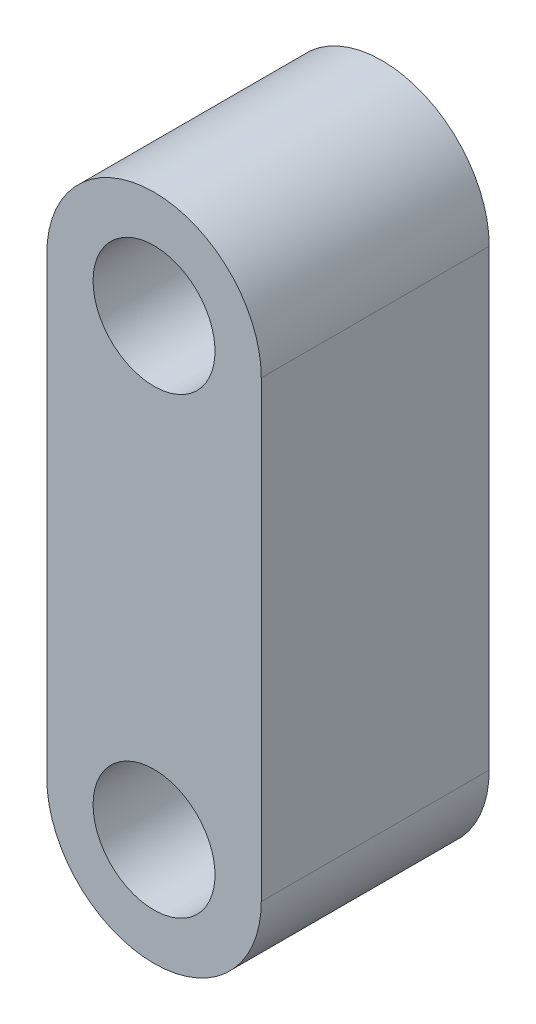
ISO-10303-21;
HEADER;
FILE_DESCRIPTION(('STEP AP214'),'2;1');
FILE_NAME('part.step','',(''),(''),'','','');
FILE_SCHEMA(('AUTOMOTIVE_DESIGN { 1 0 10303 214 1 1 1 1 }'));
ENDSEC;
DATA;
#1=APPLICATION_CONTEXT('core data for automotive mechanical design processes');
#2=APPLICATION_PROTOCOL_DEFINITION('international standard','automotive_design',2000,#1);
#3=PRODUCT_CONTEXT('',#1,'mechanical');
#4=PRODUCT('Part','Part','',(#3));
#5=PRODUCT_RELATED_PRODUCT_CATEGORY('part','',(#4));
#6=PRODUCT_DEFINITION_FORMATION('','',#4);
#7=PRODUCT_DEFINITION_CONTEXT('part definition',#1,'design');
#8=PRODUCT_DEFINITION('design','',#6,#7);
#9=PRODUCT_DEFINITION_SHAPE('','',#8);
#10=(LENGTH_UNIT() NAMED_UNIT(*) SI_UNIT(.MILLI.,.METRE.));
#11=(NAMED_UNIT(*) PLANE_ANGLE_UNIT() SI_UNIT($,.RADIAN.));
#12=(NAMED_UNIT(*) SI_UNIT($,.STERADIAN.) SOLID_ANGLE_UNIT());
#13=UNCERTAINTY_MEASURE_WITH_UNIT(LENGTH_MEASURE(1.E-05),#10,'distance_accuracy_value','');
#14=(GEOMETRIC_REPRESENTATION_CONTEXT(3) GLOBAL_UNCERTAINTY_ASSIGNED_CONTEXT((#13)) GLOBAL_UNIT_ASSIGNED_CONTEXT((#10,
#11,#12)) REPRESENTATION_CONTEXT('',''));
#15=CARTESIAN_POINT('',(0.,0.,0.));
#16=DIRECTION('',(0.,0.,1.));
#17=DIRECTION('',(1.,0.,0.));
#18=AXIS2_PLACEMENT_3D('',#15,#16,#17);
#19=CARTESIAN_POINT('',(0.,-18.9531453168014,19.05));
#20=DIRECTION('',(0.,0.,1.));
#21=DIRECTION('',(1.,0.,0.));
#22=AXIS2_PLACEMENT_3D('',#19,#20,#21);
#23=PLANE('',#22);
#24=CARTESIAN_POINT('',(0.,18.9531453168014,19.05));
#25=DIRECTION('',(0.,0.,1.));
#26=DIRECTION('',(1.,0.,0.));
#27=AXIS2_PLACEMENT_3D('',#24,#25,#26);
#28=CIRCLE('',#27,5.09524);
#29=CARTESIAN_POINT('',(-5.09524,18.9531453168014,19.05));
#30=VERTEX_POINT('',#29);
#31=EDGE_CURVE('E118',#30,#30,#28,.T.);
#32=ORIENTED_EDGE('',*,*,#31,.F.);
#33=EDGE_LOOP('',(#32));
#34=FACE_BOUND('',#33,.T.);
#35=CARTESIAN_POINT('',(0.,-18.9531453168014,19.05));
#36=DIRECTION('',(0.,0.,1.));
#37=DIRECTION('',(1.,0.,0.));
#38=AXIS2_PLACEMENT_3D('',#35,#36,#37);
#39=CIRCLE('',#38,8.96306379513761);
#40=CARTESIAN_POINT('',(-8.96306379513761,-18.9531453168014,19.05));
#41=VERTEX_POINT('',#40);
#42=CARTESIAN_POINT('',(8.96306379513761,-18.9531453168014,19.05));
#43=VERTEX_POINT('',#42);
#44=EDGE_CURVE('E97',#41,#43,#39,.T.);
#45=ORIENTED_EDGE('',*,*,#44,.T.);
#46=DIRECTION('',(0.,1.,0.));
#47=VECTOR('',#46,1.);
#48=CARTESIAN_POINT('',(8.96306379513761,-18.9531453168014,19.05));
#49=LINE('',#48,#47);
#50=CARTESIAN_POINT('',(8.96306379513761,18.9531453168014,19.05));
#51=VERTEX_POINT('',#50);
#52=EDGE_CURVE('E93',#43,#51,#49,.T.);
#53=ORIENTED_EDGE('',*,*,#52,.T.);
#54=CARTESIAN_POINT('',(0.,18.9531453168014,19.05));
#55=DIRECTION('',(0.,0.,1.));
#56=DIRECTION('',(1.,0.,0.));
#57=AXIS2_PLACEMENT_3D('',#54,#55,#56);
#58=CIRCLE('',#57,8.96306379513761);
#59=CARTESIAN_POINT('',(-8.96306379513761,18.9531453168014,19.05));
#60=VERTEX_POINT('',#59);
#61=EDGE_CURVE('E96',#51,#60,#58,.T.);
#62=ORIENTED_EDGE('',*,*,#61,.T.);
#63=DIRECTION('',(0.,-1.,0.));
#64=VECTOR('',#63,1.);
#65=CARTESIAN_POINT('',(-8.96306379513761,-18.9531453168014,19.05));
#66=LINE('',#65,#64);
#67=EDGE_CURVE('E63',#60,#41,#66,.T.);
#68=ORIENTED_EDGE('',*,*,#67,.T.);
#69=EDGE_LOOP('',(#45,#53,#62,#68));
#70=FACE_BOUND('',#69,.T.);
#71=CARTESIAN_POINT('',(0.,-18.9531453168014,19.05));
#72=DIRECTION('',(0.,0.,1.));
#73=DIRECTION('',(1.,0.,0.));
#74=AXIS2_PLACEMENT_3D('',#71,#72,#73);
#75=CIRCLE('',#74,5.09524);
#76=CARTESIAN_POINT('',(-5.09524,-18.9531453168014,19.05));
#77=VERTEX_POINT('',#76);
#78=EDGE_CURVE('E139',#77,#77,#75,.T.);
#79=ORIENTED_EDGE('',*,*,#78,.F.);
#80=EDGE_LOOP('',(#79));
#81=FACE_BOUND('',#80,.T.);
#82=ADVANCED_FACE('F44',(#34,#70,#81),#23,.T.);
#83=CARTESIAN_POINT('',(0.,-18.9531453168014,0.));
#84=DIRECTION('',(0.,0.,1.));
#85=DIRECTION('',(1.,0.,0.));
#86=AXIS2_PLACEMENT_3D('',#83,#84,#85);
#87=PLANE('',#86);
#88=CARTESIAN_POINT('',(0.,-18.9531453168014,0.));
#89=DIRECTION('',(0.,0.,1.));
#90=DIRECTION('',(1.,0.,0.));
#91=AXIS2_PLACEMENT_3D('',#88,#89,#90);
#92=CIRCLE('',#91,8.96306379513761);
#93=CARTESIAN_POINT('',(-8.96306379513761,-18.9531453168014,0.));
#94=VERTEX_POINT('',#93);
#95=CARTESIAN_POINT('',(8.96306379513761,-18.9531453168014,0.));
#96=VERTEX_POINT('',#95);
#97=EDGE_CURVE('E114',#94,#96,#92,.T.);
#98=ORIENTED_EDGE('',*,*,#97,.F.);
#99=DIRECTION('',(0.,-1.,0.));
#100=VECTOR('',#99,1.);
#101=CARTESIAN_POINT('',(-8.96306379513761,-18.9531453168014,0.));
#102=LINE('',#101,#100);
#103=CARTESIAN_POINT('',(-8.96306379513761,18.9531453168014,0.));
#104=VERTEX_POINT('',#103);
#105=EDGE_CURVE('E86',#104,#94,#102,.T.);
#106=ORIENTED_EDGE('',*,*,#105,.F.);
#107=CARTESIAN_POINT('',(0.,18.9531453168014,0.));
#108=DIRECTION('',(0.,0.,1.));
#109=DIRECTION('',(1.,0.,0.));
#110=AXIS2_PLACEMENT_3D('',#107,#108,#109);
#111=CIRCLE('',#110,8.96306379513761);
#112=CARTESIAN_POINT('',(8.96306379513761,18.9531453168014,0.));
#113=VERTEX_POINT('',#112);
#114=EDGE_CURVE('E79',#113,#104,#111,.T.);
#115=ORIENTED_EDGE('',*,*,#114,.F.);
#116=DIRECTION('',(0.,1.,0.));
#117=VECTOR('',#116,1.);
#118=CARTESIAN_POINT('',(8.96306379513761,-18.9531453168014,0.));
#119=LINE('',#118,#117);
#120=EDGE_CURVE('E104',#96,#113,#119,.T.);
#121=ORIENTED_EDGE('',*,*,#120,.F.);
#122=EDGE_LOOP('',(#98,#106,#115,#121));
#123=FACE_BOUND('',#122,.T.);
#124=CARTESIAN_POINT('',(0.,18.9531453168014,0.));
#125=DIRECTION('',(0.,0.,1.));
#126=DIRECTION('',(1.,0.,0.));
#127=AXIS2_PLACEMENT_3D('',#124,#125,#126);
#128=CIRCLE('',#127,5.09524);
#129=CARTESIAN_POINT('',(-5.09524,18.9531453168014,0.));
#130=VERTEX_POINT('',#129);
#131=EDGE_CURVE('E136',#130,#130,#128,.T.);
#132=ORIENTED_EDGE('',*,*,#131,.T.);
#133=EDGE_LOOP('',(#132));
#134=FACE_BOUND('',#133,.T.);
#135=CARTESIAN_POINT('',(0.,-18.9531453168014,0.));
#136=DIRECTION('',(0.,0.,1.));
#137=DIRECTION('',(1.,0.,0.));
#138=AXIS2_PLACEMENT_3D('',#135,#136,#137);
#139=CIRCLE('',#138,5.09524);
#140=CARTESIAN_POINT('',(-5.09524,-18.9531453168014,0.));
#141=VERTEX_POINT('',#140);
#142=EDGE_CURVE('E143',#141,#141,#139,.T.);
#143=ORIENTED_EDGE('',*,*,#142,.T.);
#144=EDGE_LOOP('',(#143));
#145=FACE_BOUND('',#144,.T.);
#146=ADVANCED_FACE('F131',(#123,#134,#145),#87,.F.);
#147=CARTESIAN_POINT('',(0.,-18.9531453168014,19.05));
#148=DIRECTION('',(0.,0.,-1.));
#149=DIRECTION('',(-1.,0.,0.));
#150=AXIS2_PLACEMENT_3D('',#147,#148,#149);
#151=CYLINDRICAL_SURFACE('',#150,8.96306379513761);
#152=ORIENTED_EDGE('',*,*,#97,.T.);
#153=DIRECTION('',(0.,0.,-1.));
#154=VECTOR('',#153,1.);
#155=CARTESIAN_POINT('',(8.96306379513761,-18.9531453168014,19.05));
#156=LINE('',#155,#154);
#157=EDGE_CURVE('E11',#43,#96,#156,.T.);
#158=ORIENTED_EDGE('',*,*,#157,.F.);
#159=ORIENTED_EDGE('',*,*,#44,.F.);
#160=DIRECTION('',(0.,0.,-1.));
#161=VECTOR('',#160,1.);
#162=CARTESIAN_POINT('',(-8.96306379513761,-18.9531453168014,19.05));
#163=LINE('',#162,#161);
#164=EDGE_CURVE('E106',#41,#94,#163,.T.);
#165=ORIENTED_EDGE('',*,*,#164,.T.);
#166=EDGE_LOOP('',(#152,#158,#159,#165));
#167=FACE_BOUND('',#166,.T.);
#168=ADVANCED_FACE('F50',(#167),#151,.T.);
#169=CARTESIAN_POINT('',(8.96306379513761,-18.9531453168014,19.05));
#170=DIRECTION('',(-1.,0.,0.));
#171=DIRECTION('',(0.,0.,1.));
#172=AXIS2_PLACEMENT_3D('',#169,#170,#171);
#173=PLANE('',#172);
#174=ORIENTED_EDGE('',*,*,#120,.T.);
#175=DIRECTION('',(0.,0.,-1.));
#176=VECTOR('',#175,1.);
#177=CARTESIAN_POINT('',(8.96306379513761,18.9531453168014,19.05));
#178=LINE('',#177,#176);
#179=EDGE_CURVE('E54',#51,#113,#178,.T.);
#180=ORIENTED_EDGE('',*,*,#179,.F.);
#181=ORIENTED_EDGE('',*,*,#52,.F.);
#182=ORIENTED_EDGE('',*,*,#157,.T.);
#183=EDGE_LOOP('',(#174,#180,#181,#182));
#184=FACE_BOUND('',#183,.T.);
#185=ADVANCED_FACE('F105',(#184),#173,.F.);
#186=CARTESIAN_POINT('',(0.,18.9531453168014,19.05));
#187=DIRECTION('',(0.,0.,-1.));
#188=DIRECTION('',(-1.,0.,0.));
#189=AXIS2_PLACEMENT_3D('',#186,#187,#188);
#190=CYLINDRICAL_SURFACE('',#189,8.96306379513761);
#191=ORIENTED_EDGE('',*,*,#114,.T.);
#192=DIRECTION('',(0.,0.,-1.));
#193=VECTOR('',#192,1.);
#194=CARTESIAN_POINT('',(-8.96306379513761,18.9531453168014,19.05));
#195=LINE('',#194,#193);
#196=EDGE_CURVE('E103',#60,#104,#195,.T.);
#197=ORIENTED_EDGE('',*,*,#196,.F.);
#198=ORIENTED_EDGE('',*,*,#61,.F.);
#199=ORIENTED_EDGE('',*,*,#179,.T.);
#200=EDGE_LOOP('',(#191,#197,#198,#199));
#201=FACE_BOUND('',#200,.T.);
#202=ADVANCED_FACE('F107',(#201),#190,.T.);
#203=CARTESIAN_POINT('',(-8.96306379513761,-18.9531453168014,19.05));
#204=DIRECTION('',(1.,0.,0.));
#205=DIRECTION('',(0.,0.,-1.));
#206=AXIS2_PLACEMENT_3D('',#203,#204,#205);
#207=PLANE('',#206);
#208=ORIENTED_EDGE('',*,*,#105,.T.);
#209=ORIENTED_EDGE('',*,*,#164,.F.);
#210=ORIENTED_EDGE('',*,*,#67,.F.);
#211=ORIENTED_EDGE('',*,*,#196,.T.);
#212=EDGE_LOOP('',(#208,#209,#210,#211));
#213=FACE_BOUND('',#212,.T.);
#214=ADVANCED_FACE('F126',(#213),#207,.F.);
#215=CARTESIAN_POINT('',(0.,18.9531453168014,19.05));
#216=DIRECTION('',(0.,0.,-1.));
#217=DIRECTION('',(-1.,0.,0.));
#218=AXIS2_PLACEMENT_3D('',#215,#216,#217);
#219=CYLINDRICAL_SURFACE('',#218,5.09524);
#220=CARTESIAN_POINT('',(-5.09524,18.9531453168014,19.05));
#221=CARTESIAN_POINT('',(-5.09524,18.9531453168014,18.8515625));
#222=CARTESIAN_POINT('',(-5.09524,18.9531453168014,18.653125));
#223=CARTESIAN_POINT('',(-5.09524,18.9531453168014,18.25625));
#224=CARTESIAN_POINT('',(-5.09524,18.9531453168014,18.0578125));
#225=CARTESIAN_POINT('',(-5.09524,18.9531453168014,17.6609375));
#226=CARTESIAN_POINT('',(-5.09524,18.9531453168014,17.4625));
#227=CARTESIAN_POINT('',(-5.09524,18.9531453168014,17.065625));
#228=CARTESIAN_POINT('',(-5.09524,18.9531453168014,16.8671875));
#229=CARTESIAN_POINT('',(-5.09524,18.9531453168014,16.4703125));
#230=CARTESIAN_POINT('',(-5.09524,18.9531453168014,16.271875));
#231=CARTESIAN_POINT('',(-5.09524,18.9531453168014,15.875));
#232=CARTESIAN_POINT('',(-5.09524,18.9531453168014,15.6765625));
#233=CARTESIAN_POINT('',(-5.09524,18.9531453168014,15.2796875));
#234=CARTESIAN_POINT('',(-5.09524,18.9531453168014,15.08125));
#235=CARTESIAN_POINT('',(-5.09524,18.9531453168014,14.684375));
#236=CARTESIAN_POINT('',(-5.09524,18.9531453168014,14.4859375));
#237=CARTESIAN_POINT('',(-5.09524,18.9531453168014,14.0890625));
#238=CARTESIAN_POINT('',(-5.09524,18.9531453168014,13.890625));
#239=CARTESIAN_POINT('',(-5.09524,18.9531453168014,13.49375));
#240=CARTESIAN_POINT('',(-5.09524,18.9531453168014,13.2953125));
#241=CARTESIAN_POINT('',(-5.09524,18.9531453168014,12.8984375));
#242=CARTESIAN_POINT('',(-5.09524,18.9531453168014,12.7));
#243=CARTESIAN_POINT('',(-5.09524,18.9531453168014,12.303125));
#244=CARTESIAN_POINT('',(-5.09524,18.9531453168014,12.1046875));
#245=CARTESIAN_POINT('',(-5.09524,18.9531453168014,11.7078125));
#246=CARTESIAN_POINT('',(-5.09524,18.9531453168014,11.509375));
#247=CARTESIAN_POINT('',(-5.09524,18.9531453168014,11.1125));
#248=CARTESIAN_POINT('',(-5.09524,18.9531453168014,10.9140625));
#249=CARTESIAN_POINT('',(-5.09524,18.9531453168014,10.5171875));
#250=CARTESIAN_POINT('',(-5.09524,18.9531453168014,10.31875));
#251=CARTESIAN_POINT('',(-5.09524,18.9531453168014,9.921875));
#252=CARTESIAN_POINT('',(-5.09524,18.9531453168014,9.7234375));
#253=CARTESIAN_POINT('',(-5.09524,18.9531453168014,9.3265625));
#254=CARTESIAN_POINT('',(-5.09524,18.9531453168014,9.128125));
#255=CARTESIAN_POINT('',(-5.09524,18.9531453168014,8.73125));
#256=CARTESIAN_POINT('',(-5.09524,18.9531453168014,8.5328125));
#257=CARTESIAN_POINT('',(-5.09524,18.9531453168014,8.1359375));
#258=CARTESIAN_POINT('',(-5.09524,18.9531453168014,7.9375));
#259=CARTESIAN_POINT('',(-5.09524,18.9531453168014,7.540625));
#260=CARTESIAN_POINT('',(-5.09524,18.9531453168014,7.3421875));
#261=CARTESIAN_POINT('',(-5.09524,18.9531453168014,6.9453125));
#262=CARTESIAN_POINT('',(-5.09524,18.9531453168014,6.746875));
#263=CARTESIAN_POINT('',(-5.09524,18.9531453168014,6.35));
#264=CARTESIAN_POINT('',(-5.09524,18.9531453168014,6.1515625));
#265=CARTESIAN_POINT('',(-5.09524,18.9531453168014,5.7546875));
#266=CARTESIAN_POINT('',(-5.09524,18.9531453168014,5.55625));
#267=CARTESIAN_POINT('',(-5.09524,18.9531453168014,5.159375));
#268=CARTESIAN_POINT('',(-5.09524,18.9531453168014,4.9609375));
#269=CARTESIAN_POINT('',(-5.09524,18.9531453168014,4.5640625));
#270=CARTESIAN_POINT('',(-5.09524,18.9531453168014,4.365625));
#271=CARTESIAN_POINT('',(-5.09524,18.9531453168014,3.96875));
#272=CARTESIAN_POINT('',(-5.09524,18.9531453168014,3.7703125));
#273=CARTESIAN_POINT('',(-5.09524,18.9531453168014,3.3734375));
#274=CARTESIAN_POINT('',(-5.09524,18.9531453168014,3.175));
#275=CARTESIAN_POINT('',(-5.09524,18.9531453168014,2.778125));
#276=CARTESIAN_POINT('',(-5.09524,18.9531453168014,2.5796875));
#277=CARTESIAN_POINT('',(-5.09524,18.9531453168014,2.1828125));
#278=CARTESIAN_POINT('',(-5.09524,18.9531453168014,1.984375));
#279=CARTESIAN_POINT('',(-5.09524,18.9531453168014,1.5875));
#280=CARTESIAN_POINT('',(-5.09524,18.9531453168014,1.3890625));
#281=CARTESIAN_POINT('',(-5.09524,18.9531453168014,0.992187500000001));
#282=CARTESIAN_POINT('',(-5.09524,18.9531453168014,0.793750000000001));
#283=CARTESIAN_POINT('',(-5.09524,18.9531453168014,0.396875));
#284=CARTESIAN_POINT('',(-5.09524,18.9531453168014,0.1984375));
#285=CARTESIAN_POINT('',(-5.09524,18.9531453168014,0.));
#286=B_SPLINE_CURVE_WITH_KNOTS('',3,(#220,#221,#222,#223,#224,#225,#226,#227,#228,#229,#230,
#231,#232,#233,#234,#235,#236,#237,#238,#239,#240,#241,#242,#243,#244,#245,#246,#247,#248,#249,
#250,#251,#252,#253,#254,#255,#256,#257,#258,#259,#260,#261,#262,#263,#264,#265,#266,#267,#268,
#269,#270,#271,#272,#273,#274,#275,#276,#277,#278,#279,#280,#281,#282,#283,#284,#285),
.UNSPECIFIED.,.F.,.F.,(4,2,2,2,2,2,2,2,2,2,2,2,2,2,2,2,2,2,2,2,2,2,2,2,2,2,2,2,2,2,2,2,4),(0.,
0.595312499999997,1.190625,1.7859375,2.38125,2.9765625,3.571875,4.1671875,4.7625,5.3578125,
5.953125,6.5484375,7.14375,7.7390625,8.334375,8.9296875,9.525,10.1203125,10.715625,11.3109375,
11.90625,12.5015625,13.096875,13.6921875,14.2875,14.8828125,15.478125,16.0734375,16.66875,
17.2640625,17.859375,18.4546875,19.05),.UNSPECIFIED.);
#287=EDGE_CURVE('BSEAM163',#30,#130,#286,.T.);
#288=ORIENTED_EDGE('',*,*,#31,.T.);
#289=ORIENTED_EDGE('',*,*,#131,.F.);
#290=ORIENTED_EDGE('',*,*,#287,.T.);
#291=ORIENTED_EDGE('',*,*,#287,.F.);
#292=EDGE_LOOP('',(#288,#290,#289,#291));
#293=FACE_BOUND('',#292,.T.);
#294=ADVANCED_FACE('F163',(#293),#219,.F.);
#295=CARTESIAN_POINT('',(0.,-18.9531453168014,19.05));
#296=DIRECTION('',(0.,0.,-1.));
#297=DIRECTION('',(-1.,0.,0.));
#298=AXIS2_PLACEMENT_3D('',#295,#296,#297);
#299=CYLINDRICAL_SURFACE('',#298,5.09524);
#300=CARTESIAN_POINT('',(-5.09524,-18.9531453168014,19.05));
#301=CARTESIAN_POINT('',(-5.09524,-18.9531453168014,18.8515625));
#302=CARTESIAN_POINT('',(-5.09524,-18.9531453168014,18.653125));
#303=CARTESIAN_POINT('',(-5.09524,-18.9531453168014,18.25625));
#304=CARTESIAN_POINT('',(-5.09524,-18.9531453168014,18.0578125));
#305=CARTESIAN_POINT('',(-5.09524,-18.9531453168014,17.6609375));
#306=CARTESIAN_POINT('',(-5.09524,-18.9531453168014,17.4625));
#307=CARTESIAN_POINT('',(-5.09524,-18.9531453168014,17.065625));
#308=CARTESIAN_POINT('',(-5.09524,-18.9531453168014,16.8671875));
#309=CARTESIAN_POINT('',(-5.09524,-18.9531453168014,16.4703125));
#310=CARTESIAN_POINT('',(-5.09524,-18.9531453168014,16.271875));
#311=CARTESIAN_POINT('',(-5.09524,-18.9531453168014,15.875));
#312=CARTESIAN_POINT('',(-5.09524,-18.9531453168014,15.6765625));
#313=CARTESIAN_POINT('',(-5.09524,-18.9531453168014,15.2796875));
#314=CARTESIAN_POINT('',(-5.09524,-18.9531453168014,15.08125));
#315=CARTESIAN_POINT('',(-5.09524,-18.9531453168014,14.684375));
#316=CARTESIAN_POINT('',(-5.09524,-18.9531453168014,14.4859375));
#317=CARTESIAN_POINT('',(-5.09524,-18.9531453168014,14.0890625));
#318=CARTESIAN_POINT('',(-5.09524,-18.9531453168014,13.890625));
#319=CARTESIAN_POINT('',(-5.09524,-18.9531453168014,13.49375));
#320=CARTESIAN_POINT('',(-5.09524,-18.9531453168014,13.2953125));
#321=CARTESIAN_POINT('',(-5.09524,-18.9531453168014,12.8984375));
#322=CARTESIAN_POINT('',(-5.09524,-18.9531453168014,12.7));
#323=CARTESIAN_POINT('',(-5.09524,-18.9531453168014,12.303125));
#324=CARTESIAN_POINT('',(-5.09524,-18.9531453168014,12.1046875));
#325=CARTESIAN_POINT('',(-5.09524,-18.9531453168014,11.7078125));
#326=CARTESIAN_POINT('',(-5.09524,-18.9531453168014,11.509375));
#327=CARTESIAN_POINT('',(-5.09524,-18.9531453168014,11.1125));
#328=CARTESIAN_POINT('',(-5.09524,-18.9531453168014,10.9140625));
#329=CARTESIAN_POINT('',(-5.09524,-18.9531453168014,10.5171875));
#330=CARTESIAN_POINT('',(-5.09524,-18.9531453168014,10.31875));
#331=CARTESIAN_POINT('',(-5.09524,-18.9531453168014,9.921875));
#332=CARTESIAN_POINT('',(-5.09524,-18.9531453168014,9.7234375));
#333=CARTESIAN_POINT('',(-5.09524,-18.9531453168014,9.3265625));
#334=CARTESIAN_POINT('',(-5.09524,-18.9531453168014,9.128125));
#335=CARTESIAN_POINT('',(-5.09524,-18.9531453168014,8.73125));
#336=CARTESIAN_POINT('',(-5.09524,-18.9531453168014,8.5328125));
#337=CARTESIAN_POINT('',(-5.09524,-18.9531453168014,8.1359375));
#338=CARTESIAN_POINT('',(-5.09524,-18.9531453168014,7.9375));
#339=CARTESIAN_POINT('',(-5.09524,-18.9531453168014,7.540625));
#340=CARTESIAN_POINT('',(-5.09524,-18.9531453168014,7.3421875));
#341=CARTESIAN_POINT('',(-5.09524,-18.9531453168014,6.9453125));
#342=CARTESIAN_POINT('',(-5.09524,-18.9531453168014,6.746875));
#343=CARTESIAN_POINT('',(-5.09524,-18.9531453168014,6.35));
#344=CARTESIAN_POINT('',(-5.09524,-18.9531453168014,6.1515625));
#345=CARTESIAN_POINT('',(-5.09524,-18.9531453168014,5.7546875));
#346=CARTESIAN_POINT('',(-5.09524,-18.9531453168014,5.55625));
#347=CARTESIAN_POINT('',(-5.09524,-18.9531453168014,5.159375));
#348=CARTESIAN_POINT('',(-5.09524,-18.9531453168014,4.9609375));
#349=CARTESIAN_POINT('',(-5.09524,-18.9531453168014,4.5640625));
#350=CARTESIAN_POINT('',(-5.09524,-18.9531453168014,4.365625));
#351=CARTESIAN_POINT('',(-5.09524,-18.9531453168014,3.96875));
#352=CARTESIAN_POINT('',(-5.09524,-18.9531453168014,3.7703125));
#353=CARTESIAN_POINT('',(-5.09524,-18.9531453168014,3.3734375));
#354=CARTESIAN_POINT('',(-5.09524,-18.9531453168014,3.175));
#355=CARTESIAN_POINT('',(-5.09524,-18.9531453168014,2.778125));
#356=CARTESIAN_POINT('',(-5.09524,-18.9531453168014,2.5796875));
#357=CARTESIAN_POINT('',(-5.09524,-18.9531453168014,2.1828125));
#358=CARTESIAN_POINT('',(-5.09524,-18.9531453168014,1.984375));
#359=CARTESIAN_POINT('',(-5.09524,-18.9531453168014,1.5875));
#360=CARTESIAN_POINT('',(-5.09524,-18.9531453168014,1.3890625));
#361=CARTESIAN_POINT('',(-5.09524,-18.9531453168014,0.992187500000001));
#362=CARTESIAN_POINT('',(-5.09524,-18.9531453168014,0.793750000000001));
#363=CARTESIAN_POINT('',(-5.09524,-18.9531453168014,0.396875));
#364=CARTESIAN_POINT('',(-5.09524,-18.9531453168014,0.1984375));
#365=CARTESIAN_POINT('',(-5.09524,-18.9531453168014,0.));
#366=B_SPLINE_CURVE_WITH_KNOTS('',3,(#300,#301,#302,#303,#304,#305,#306,#307,#308,#309,#310,
#311,#312,#313,#314,#315,#316,#317,#318,#319,#320,#321,#322,#323,#324,#325,#326,#327,#328,#329,
#330,#331,#332,#333,#334,#335,#336,#337,#338,#339,#340,#341,#342,#343,#344,#345,#346,#347,#348,
#349,#350,#351,#352,#353,#354,#355,#356,#357,#358,#359,#360,#361,#362,#363,#364,#365),
.UNSPECIFIED.,.F.,.F.,(4,2,2,2,2,2,2,2,2,2,2,2,2,2,2,2,2,2,2,2,2,2,2,2,2,2,2,2,2,2,2,2,4),(0.,
0.595312499999997,1.190625,1.7859375,2.38125,2.9765625,3.571875,4.1671875,4.7625,5.3578125,
5.953125,6.5484375,7.14375,7.7390625,8.334375,8.9296875,9.525,10.1203125,10.715625,11.3109375,
11.90625,12.5015625,13.096875,13.6921875,14.2875,14.8828125,15.478125,16.0734375,16.66875,
17.2640625,17.859375,18.4546875,19.05),.UNSPECIFIED.);
#367=EDGE_CURVE('BSEAM155',#77,#141,#366,.T.);
#368=ORIENTED_EDGE('',*,*,#78,.T.);
#369=ORIENTED_EDGE('',*,*,#142,.F.);
#370=ORIENTED_EDGE('',*,*,#367,.T.);
#371=ORIENTED_EDGE('',*,*,#367,.F.);
#372=EDGE_LOOP('',(#368,#370,#369,#371));
#373=FACE_BOUND('',#372,.T.);
#374=ADVANCED_FACE('F155',(#373),#299,.F.);
#375=CLOSED_SHELL('',(#82,#146,#168,#185,#202,#214,#294,#374));
#376=MANIFOLD_SOLID_BREP('B2',#375);
#377=ADVANCED_BREP_SHAPE_REPRESENTATION('',(#18,#376),#14);
#378=SHAPE_DEFINITION_REPRESENTATION(#9,#377);
ENDSEC;
END-ISO-10303-21;
